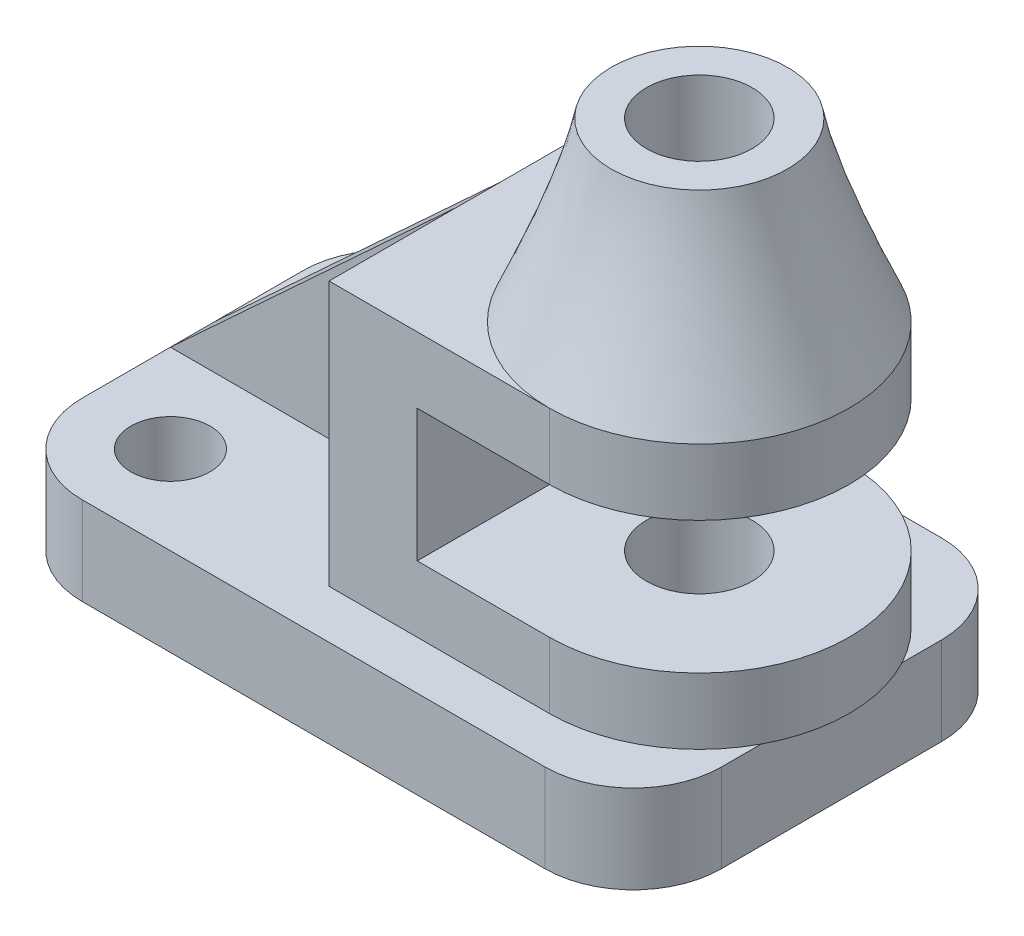
ISO-10303-21;
HEADER;
FILE_DESCRIPTION(('STEP AP214'),'2;1');
FILE_NAME('part.step','',(''),(''),'','','');
FILE_SCHEMA(('AUTOMOTIVE_DESIGN { 1 0 10303 214 1 1 1 1 }'));
ENDSEC;
DATA;
#1=APPLICATION_CONTEXT('core data for automotive mechanical design processes');
#2=APPLICATION_PROTOCOL_DEFINITION('international standard','automotive_design',2000,#1);
#3=PRODUCT_CONTEXT('',#1,'mechanical');
#4=PRODUCT('Part','Part','',(#3));
#5=PRODUCT_RELATED_PRODUCT_CATEGORY('part','',(#4));
#6=PRODUCT_DEFINITION_FORMATION('','',#4);
#7=PRODUCT_DEFINITION_CONTEXT('part definition',#1,'design');
#8=PRODUCT_DEFINITION('design','',#6,#7);
#9=PRODUCT_DEFINITION_SHAPE('','',#8);
#10=(LENGTH_UNIT() NAMED_UNIT(*) SI_UNIT(.MILLI.,.METRE.));
#11=(NAMED_UNIT(*) PLANE_ANGLE_UNIT() SI_UNIT($,.RADIAN.));
#12=(NAMED_UNIT(*) SI_UNIT($,.STERADIAN.) SOLID_ANGLE_UNIT());
#13=UNCERTAINTY_MEASURE_WITH_UNIT(LENGTH_MEASURE(1.E-05),#10,'distance_accuracy_value','');
#14=(GEOMETRIC_REPRESENTATION_CONTEXT(3) GLOBAL_UNCERTAINTY_ASSIGNED_CONTEXT((#13)) GLOBAL_UNIT_ASSIGNED_CONTEXT((#10,
#11,#12)) REPRESENTATION_CONTEXT('',''));
#15=CARTESIAN_POINT('',(0.,0.,0.));
#16=DIRECTION('',(0.,0.,1.));
#17=DIRECTION('',(1.,0.,0.));
#18=AXIS2_PLACEMENT_3D('',#15,#16,#17);
#19=CARTESIAN_POINT('',(52.5,0.,-25.));
#20=DIRECTION('',(0.,-1.,0.));
#21=DIRECTION('',(0.,0.,-1.));
#22=AXIS2_PLACEMENT_3D('',#19,#20,#21);
#23=PLANE('',#22);
#24=CARTESIAN_POINT('',(-52.5,0.,25.));
#25=DIRECTION('',(0.,1.,0.));
#26=DIRECTION('',(0.,0.,1.));
#27=AXIS2_PLACEMENT_3D('',#24,#25,#26);
#28=CIRCLE('',#27,9.);
#29=CARTESIAN_POINT('',(-52.5,0.,34.));
#30=VERTEX_POINT('',#29);
#31=EDGE_CURVE('E382',#30,#30,#28,.T.);
#32=ORIENTED_EDGE('',*,*,#31,.F.);
#33=EDGE_LOOP('',(#32));
#34=FACE_BOUND('',#33,.T.);
#35=DIRECTION('',(1.,0.,0.));
#36=VECTOR('',#35,1.);
#37=CARTESIAN_POINT('',(-72.5,0.,5.00000000000001));
#38=LINE('',#37,#36);
#39=CARTESIAN_POINT('',(-72.5,0.,5.));
#40=VERTEX_POINT('',#39);
#41=CARTESIAN_POINT('',(-7.49999999999999,0.,5.00000000000001));
#42=VERTEX_POINT('',#41);
#43=EDGE_CURVE('E192',#40,#42,#38,.T.);
#44=ORIENTED_EDGE('',*,*,#43,.F.);
#45=DIRECTION('',(0.,0.,1.));
#46=VECTOR('',#45,1.);
#47=CARTESIAN_POINT('',(-72.5,0.,-24.9999999999999));
#48=LINE('',#47,#46);
#49=CARTESIAN_POINT('',(-72.5,0.,24.9999999999999));
#50=VERTEX_POINT('',#49);
#51=EDGE_CURVE('E196',#40,#50,#48,.T.);
#52=ORIENTED_EDGE('',*,*,#51,.T.);
#53=CARTESIAN_POINT('',(-52.5,0.,25.));
#54=DIRECTION('',(0.,1.,0.));
#55=DIRECTION('',(0.,0.,1.));
#56=AXIS2_PLACEMENT_3D('',#53,#54,#55);
#57=CIRCLE('',#56,20.);
#58=CARTESIAN_POINT('',(-52.5,0.,45.));
#59=VERTEX_POINT('',#58);
#60=EDGE_CURVE('E210',#50,#59,#57,.T.);
#61=ORIENTED_EDGE('',*,*,#60,.T.);
#62=DIRECTION('',(1.,0.,0.));
#63=VECTOR('',#62,1.);
#64=CARTESIAN_POINT('',(-52.4999999999999,0.,45.));
#65=LINE('',#64,#63);
#66=CARTESIAN_POINT('',(52.4999999999999,0.,45.));
#67=VERTEX_POINT('',#66);
#68=EDGE_CURVE('E217',#59,#67,#65,.T.);
#69=ORIENTED_EDGE('',*,*,#68,.T.);
#70=CARTESIAN_POINT('',(52.5,0.,25.));
#71=DIRECTION('',(0.,1.,0.));
#72=DIRECTION('',(0.,0.,1.));
#73=AXIS2_PLACEMENT_3D('',#70,#71,#72);
#74=CIRCLE('',#73,20.);
#75=CARTESIAN_POINT('',(72.5,0.,24.9999999999999));
#76=VERTEX_POINT('',#75);
#77=EDGE_CURVE('E220',#67,#76,#74,.T.);
#78=ORIENTED_EDGE('',*,*,#77,.T.);
#79=DIRECTION('',(0.,0.,-1.));
#80=VECTOR('',#79,1.);
#81=CARTESIAN_POINT('',(72.5,0.,-24.9999999999999));
#82=LINE('',#81,#80);
#83=CARTESIAN_POINT('',(72.5,0.,16.));
#84=VERTEX_POINT('',#83);
#85=EDGE_CURVE('E224',#76,#84,#82,.T.);
#86=ORIENTED_EDGE('',*,*,#85,.T.);
#87=CARTESIAN_POINT('',(42.5,0.,0.));
#88=DIRECTION('',(0.,1.,0.));
#89=DIRECTION('',(0.,0.,1.));
#90=AXIS2_PLACEMENT_3D('',#87,#88,#89);
#91=CIRCLE('',#90,34.);
#92=CARTESIAN_POINT('',(42.5,0.,34.));
#93=VERTEX_POINT('',#92);
#94=EDGE_CURVE('E399',#93,#84,#91,.T.);
#95=ORIENTED_EDGE('',*,*,#94,.F.);
#96=DIRECTION('',(1.,0.,0.));
#97=VECTOR('',#96,1.);
#98=CARTESIAN_POINT('',(-7.49999999999998,0.,34.));
#99=LINE('',#98,#97);
#100=CARTESIAN_POINT('',(-7.49999999999998,0.,34.));
#101=VERTEX_POINT('',#100);
#102=EDGE_CURVE('E391',#101,#93,#99,.T.);
#103=ORIENTED_EDGE('',*,*,#102,.F.);
#104=DIRECTION('',(0.,0.,1.));
#105=VECTOR('',#104,1.);
#106=CARTESIAN_POINT('',(-7.49999999999999,0.,-34.));
#107=LINE('',#106,#105);
#108=EDGE_CURVE('E199',#42,#101,#107,.T.);
#109=ORIENTED_EDGE('',*,*,#108,.F.);
#110=EDGE_LOOP('',(#44,#52,#61,#69,#78,#86,#95,#103,#109));
#111=FACE_BOUND('',#110,.T.);
#112=ADVANCED_FACE('F44',(#34,#111),#23,.F.);
#113=CARTESIAN_POINT('',(-52.5,0.,-25.));
#114=DIRECTION('',(0.,1.,0.));
#115=DIRECTION('',(0.,0.,1.));
#116=AXIS2_PLACEMENT_3D('',#113,#114,#115);
#117=CIRCLE('',#116,9.);
#118=CARTESIAN_POINT('',(-52.5,0.,-16.));
#119=VERTEX_POINT('',#118);
#120=EDGE_CURVE('E356',#119,#119,#117,.T.);
#121=ORIENTED_EDGE('',*,*,#120,.F.);
#122=EDGE_LOOP('',(#121));
#123=FACE_BOUND('',#122,.T.);
#124=DIRECTION('',(1.,0.,0.));
#125=VECTOR('',#124,1.);
#126=CARTESIAN_POINT('',(-72.5,0.,-4.99999999999999));
#127=LINE('',#126,#125);
#128=CARTESIAN_POINT('',(-72.5,0.,-4.99999999999999));
#129=VERTEX_POINT('',#128);
#130=CARTESIAN_POINT('',(-7.49999999999999,0.,-5.));
#131=VERTEX_POINT('',#130);
#132=EDGE_CURVE('E200',#129,#131,#127,.T.);
#133=ORIENTED_EDGE('',*,*,#132,.T.);
#134=CARTESIAN_POINT('',(-7.49999999999999,0.,-34.));
#135=VERTEX_POINT('',#134);
#136=EDGE_CURVE('E394',#135,#131,#107,.T.);
#137=ORIENTED_EDGE('',*,*,#136,.F.);
#138=DIRECTION('',(-1.,0.,0.));
#139=VECTOR('',#138,1.);
#140=CARTESIAN_POINT('',(-7.49999999999999,0.,-34.));
#141=LINE('',#140,#139);
#142=CARTESIAN_POINT('',(42.5,0.,-34.));
#143=VERTEX_POINT('',#142);
#144=EDGE_CURVE('E396',#143,#135,#141,.T.);
#145=ORIENTED_EDGE('',*,*,#144,.F.);
#146=CARTESIAN_POINT('',(72.5,0.,-16.0000000000001));
#147=VERTEX_POINT('',#146);
#148=EDGE_CURVE('E232',#147,#143,#91,.T.);
#149=ORIENTED_EDGE('',*,*,#148,.F.);
#150=CARTESIAN_POINT('',(72.5,0.,-24.9999999999999));
#151=VERTEX_POINT('',#150);
#152=EDGE_CURVE('E223',#147,#151,#82,.T.);
#153=ORIENTED_EDGE('',*,*,#152,.T.);
#154=CARTESIAN_POINT('',(52.5,0.,-25.));
#155=DIRECTION('',(0.,1.,0.));
#156=DIRECTION('',(0.,0.,-1.));
#157=AXIS2_PLACEMENT_3D('',#154,#155,#156);
#158=CIRCLE('',#157,20.);
#159=CARTESIAN_POINT('',(52.4999999999999,0.,-45.));
#160=VERTEX_POINT('',#159);
#161=EDGE_CURVE('E348',#151,#160,#158,.T.);
#162=ORIENTED_EDGE('',*,*,#161,.T.);
#163=DIRECTION('',(-1.,0.,0.));
#164=VECTOR('',#163,1.);
#165=CARTESIAN_POINT('',(-52.4999999999999,0.,-45.));
#166=LINE('',#165,#164);
#167=CARTESIAN_POINT('',(-52.4999999999999,0.,-45.));
#168=VERTEX_POINT('',#167);
#169=EDGE_CURVE('E212',#160,#168,#166,.T.);
#170=ORIENTED_EDGE('',*,*,#169,.T.);
#171=CARTESIAN_POINT('',(-52.5,0.,-25.));
#172=DIRECTION('',(0.,1.,0.));
#173=DIRECTION('',(0.,0.,1.));
#174=AXIS2_PLACEMENT_3D('',#171,#172,#173);
#175=CIRCLE('',#174,20.);
#176=CARTESIAN_POINT('',(-72.5,0.,-24.9999999999999));
#177=VERTEX_POINT('',#176);
#178=EDGE_CURVE('E208',#168,#177,#175,.T.);
#179=ORIENTED_EDGE('',*,*,#178,.T.);
#180=EDGE_CURVE('E207',#177,#129,#48,.T.);
#181=ORIENTED_EDGE('',*,*,#180,.T.);
#182=EDGE_LOOP('',(#133,#137,#145,#149,#153,#162,#170,#179,#181));
#183=FACE_BOUND('',#182,.T.);
#184=ADVANCED_FACE('F314',(#123,#183),#23,.F.);
#185=CARTESIAN_POINT('',(-7.49999999999999,60.,-34.));
#186=DIRECTION('',(1.,0.,0.));
#187=DIRECTION('',(0.,0.,-1.));
#188=AXIS2_PLACEMENT_3D('',#185,#186,#187);
#189=PLANE('',#188);
#190=DIRECTION('',(0.,1.,0.));
#191=VECTOR('',#190,1.);
#192=CARTESIAN_POINT('',(-7.49999999999998,60.,5.00000000000001));
#193=LINE('',#192,#191);
#194=CARTESIAN_POINT('',(-7.49999999999999,60.,5.));
#195=VERTEX_POINT('',#194);
#196=EDGE_CURVE('E66',#42,#195,#193,.T.);
#197=ORIENTED_EDGE('',*,*,#196,.F.);
#198=ORIENTED_EDGE('',*,*,#108,.T.);
#199=DIRECTION('',(0.,-1.,0.));
#200=VECTOR('',#199,1.);
#201=CARTESIAN_POINT('',(-7.49999999999998,60.,34.));
#202=LINE('',#201,#200);
#203=CARTESIAN_POINT('',(-7.49999999999998,60.,34.));
#204=VERTEX_POINT('',#203);
#205=EDGE_CURVE('E256',#204,#101,#202,.T.);
#206=ORIENTED_EDGE('',*,*,#205,.F.);
#207=DIRECTION('',(0.,0.,1.));
#208=VECTOR('',#207,1.);
#209=CARTESIAN_POINT('',(-7.49999999999999,60.,-34.));
#210=LINE('',#209,#208);
#211=EDGE_CURVE('E405',#195,#204,#210,.T.);
#212=ORIENTED_EDGE('',*,*,#211,.F.);
#213=EDGE_LOOP('',(#197,#198,#206,#212));
#214=FACE_BOUND('',#213,.T.);
#215=ADVANCED_FACE('F466',(#214),#189,.F.);
#216=DIRECTION('',(0.,-1.,0.));
#217=VECTOR('',#216,1.);
#218=CARTESIAN_POINT('',(-7.49999999999999,60.,-5.));
#219=LINE('',#218,#217);
#220=CARTESIAN_POINT('',(-7.49999999999999,60.,-5.));
#221=VERTEX_POINT('',#220);
#222=EDGE_CURVE('E201',#221,#131,#219,.T.);
#223=ORIENTED_EDGE('',*,*,#222,.F.);
#224=CARTESIAN_POINT('',(-7.49999999999999,60.,-34.));
#225=VERTEX_POINT('',#224);
#226=EDGE_CURVE('E250',#225,#221,#210,.T.);
#227=ORIENTED_EDGE('',*,*,#226,.F.);
#228=DIRECTION('',(0.,-1.,0.));
#229=VECTOR('',#228,1.);
#230=CARTESIAN_POINT('',(-7.49999999999999,60.,-34.));
#231=LINE('',#230,#229);
#232=EDGE_CURVE('E269',#225,#135,#231,.T.);
#233=ORIENTED_EDGE('',*,*,#232,.T.);
#234=ORIENTED_EDGE('',*,*,#136,.T.);
#235=EDGE_LOOP('',(#223,#227,#233,#234));
#236=FACE_BOUND('',#235,.T.);
#237=ADVANCED_FACE('F513',(#236),#189,.F.);
#238=CARTESIAN_POINT('',(42.5,60.,0.));
#239=DIRECTION('',(0.,-1.,0.));
#240=DIRECTION('',(0.,0.,-1.));
#241=AXIS2_PLACEMENT_3D('',#238,#239,#240);
#242=CYLINDRICAL_SURFACE('',#241,34.);
#243=DIRECTION('',(0.,-1.,0.));
#244=VECTOR('',#243,1.);
#245=CARTESIAN_POINT('',(42.5,60.,-34.));
#246=LINE('',#245,#244);
#247=CARTESIAN_POINT('',(42.5,15.,-34.));
#248=VERTEX_POINT('',#247);
#249=EDGE_CURVE('E266',#248,#143,#246,.T.);
#250=ORIENTED_EDGE('',*,*,#249,.F.);
#251=CARTESIAN_POINT('',(42.5,15.,0.));
#252=DIRECTION('',(0.,-1.,0.));
#253=DIRECTION('',(0.,0.,-1.));
#254=AXIS2_PLACEMENT_3D('',#251,#252,#253);
#255=CIRCLE('',#254,34.);
#256=CARTESIAN_POINT('',(42.5,15.,34.));
#257=VERTEX_POINT('',#256);
#258=EDGE_CURVE('E537',#248,#257,#255,.T.);
#259=ORIENTED_EDGE('',*,*,#258,.T.);
#260=DIRECTION('',(0.,-1.,0.));
#261=VECTOR('',#260,1.);
#262=CARTESIAN_POINT('',(42.5,60.,34.));
#263=LINE('',#262,#261);
#264=EDGE_CURVE('E249',#257,#93,#263,.T.);
#265=ORIENTED_EDGE('',*,*,#264,.T.);
#266=ORIENTED_EDGE('',*,*,#94,.T.);
#267=EDGE_CURVE('E402',#84,#147,#91,.T.);
#268=ORIENTED_EDGE('',*,*,#267,.T.);
#269=ORIENTED_EDGE('',*,*,#148,.T.);
#270=EDGE_LOOP('',(#250,#259,#265,#266,#268,#269));
#271=FACE_BOUND('',#270,.T.);
#272=ADVANCED_FACE('F297',(#271),#242,.T.);
#273=CARTESIAN_POINT('',(42.5,-20.,0.));
#274=DIRECTION('',(0.,1.,0.));
#275=DIRECTION('',(0.,0.,1.));
#276=AXIS2_PLACEMENT_3D('',#273,#274,#275);
#277=CYLINDRICAL_SURFACE('',#276,12.);
#278=CARTESIAN_POINT('',(42.5,15.,0.));
#279=DIRECTION('',(0.,-1.,0.));
#280=DIRECTION('',(0.,0.,-1.));
#281=AXIS2_PLACEMENT_3D('',#278,#279,#280);
#282=CIRCLE('',#281,12.);
#283=CARTESIAN_POINT('',(42.5,15.,12.));
#284=VERTEX_POINT('',#283);
#285=EDGE_CURVE('E264',#284,#284,#282,.F.);
#286=CARTESIAN_POINT('',(42.5,-20.,0.));
#287=DIRECTION('',(0.,1.,0.));
#288=DIRECTION('',(0.,0.,1.));
#289=AXIS2_PLACEMENT_3D('',#286,#287,#288);
#290=CIRCLE('',#289,12.);
#291=CARTESIAN_POINT('',(42.5,-20.,12.));
#292=VERTEX_POINT('',#291);
#293=EDGE_CURVE('E411',#292,#292,#290,.T.);
#294=CARTESIAN_POINT('',(42.5,15.,12.));
#295=CARTESIAN_POINT('',(42.5,14.6354166666667,12.));
#296=CARTESIAN_POINT('',(42.5,14.2708333333333,12.));
#297=CARTESIAN_POINT('',(42.5,13.5416666666667,12.));
#298=CARTESIAN_POINT('',(42.5,13.1770833333333,12.));
#299=CARTESIAN_POINT('',(42.5,12.4479166666667,12.));
#300=CARTESIAN_POINT('',(42.5,12.0833333333333,12.));
#301=CARTESIAN_POINT('',(42.5,11.3541666666667,12.));
#302=CARTESIAN_POINT('',(42.5,10.9895833333333,12.));
#303=CARTESIAN_POINT('',(42.5,10.2604166666667,12.));
#304=CARTESIAN_POINT('',(42.5,9.89583333333334,12.));
#305=CARTESIAN_POINT('',(42.5,9.16666666666667,12.));
#306=CARTESIAN_POINT('',(42.5,8.80208333333334,12.));
#307=CARTESIAN_POINT('',(42.5,8.07291666666667,12.));
#308=CARTESIAN_POINT('',(42.5,7.70833333333334,12.));
#309=CARTESIAN_POINT('',(42.5,6.97916666666667,12.));
#310=CARTESIAN_POINT('',(42.5,6.61458333333334,12.));
#311=CARTESIAN_POINT('',(42.5,5.88541666666667,12.));
#312=CARTESIAN_POINT('',(42.5,5.52083333333334,12.));
#313=CARTESIAN_POINT('',(42.5,4.79166666666667,12.));
#314=CARTESIAN_POINT('',(42.5,4.42708333333334,12.));
#315=CARTESIAN_POINT('',(42.5,3.69791666666667,12.));
#316=CARTESIAN_POINT('',(42.5,3.33333333333334,12.));
#317=CARTESIAN_POINT('',(42.5,2.60416666666667,12.));
#318=CARTESIAN_POINT('',(42.5,2.23958333333334,12.));
#319=CARTESIAN_POINT('',(42.5,1.51041666666667,12.));
#320=CARTESIAN_POINT('',(42.5,1.14583333333334,12.));
#321=CARTESIAN_POINT('',(42.5,0.416666666666668,12.));
#322=CARTESIAN_POINT('',(42.5,0.0520833333333356,12.));
#323=CARTESIAN_POINT('',(42.5,-0.67708333333333,12.));
#324=CARTESIAN_POINT('',(42.5,-1.04166666666666,12.));
#325=CARTESIAN_POINT('',(42.5,-1.77083333333333,12.));
#326=CARTESIAN_POINT('',(42.5,-2.13541666666667,12.));
#327=CARTESIAN_POINT('',(42.5,-2.86458333333333,12.));
#328=CARTESIAN_POINT('',(42.5,-3.22916666666667,12.));
#329=CARTESIAN_POINT('',(42.5,-3.95833333333333,12.));
#330=CARTESIAN_POINT('',(42.5,-4.32291666666667,12.));
#331=CARTESIAN_POINT('',(42.5,-5.05208333333333,12.));
#332=CARTESIAN_POINT('',(42.5,-5.41666666666667,12.));
#333=CARTESIAN_POINT('',(42.5,-6.14583333333333,12.));
#334=CARTESIAN_POINT('',(42.5,-6.51041666666667,12.));
#335=CARTESIAN_POINT('',(42.5,-7.23958333333333,12.));
#336=CARTESIAN_POINT('',(42.5,-7.60416666666667,12.));
#337=CARTESIAN_POINT('',(42.5,-8.33333333333333,12.));
#338=CARTESIAN_POINT('',(42.5,-8.69791666666667,12.));
#339=CARTESIAN_POINT('',(42.5,-9.42708333333333,12.));
#340=CARTESIAN_POINT('',(42.5,-9.79166666666667,12.));
#341=CARTESIAN_POINT('',(42.5,-10.5208333333333,12.));
#342=CARTESIAN_POINT('',(42.5,-10.8854166666667,12.));
#343=CARTESIAN_POINT('',(42.5,-11.6145833333333,12.));
#344=CARTESIAN_POINT('',(42.5,-11.9791666666667,12.));
#345=CARTESIAN_POINT('',(42.5,-12.7083333333333,12.));
#346=CARTESIAN_POINT('',(42.5,-13.0729166666667,12.));
#347=CARTESIAN_POINT('',(42.5,-13.8020833333333,12.));
#348=CARTESIAN_POINT('',(42.5,-14.1666666666667,12.));
#349=CARTESIAN_POINT('',(42.5,-14.8958333333333,12.));
#350=CARTESIAN_POINT('',(42.5,-15.2604166666667,12.));
#351=CARTESIAN_POINT('',(42.5,-15.9895833333333,12.));
#352=CARTESIAN_POINT('',(42.5,-16.3541666666667,12.));
#353=CARTESIAN_POINT('',(42.5,-17.0833333333333,12.));
#354=CARTESIAN_POINT('',(42.5,-17.4479166666667,12.));
#355=CARTESIAN_POINT('',(42.5,-18.1770833333333,12.));
#356=CARTESIAN_POINT('',(42.5,-18.5416666666667,12.));
#357=CARTESIAN_POINT('',(42.5,-19.2708333333333,12.));
#358=CARTESIAN_POINT('',(42.5,-19.6354166666667,12.));
#359=CARTESIAN_POINT('',(42.5,-20.,12.));
#360=B_SPLINE_CURVE_WITH_KNOTS('',3,(#294,#295,#296,#297,#298,#299,#300,#301,#302,#303,#304,
#305,#306,#307,#308,#309,#310,#311,#312,#313,#314,#315,#316,#317,#318,#319,#320,#321,#322,#323,
#324,#325,#326,#327,#328,#329,#330,#331,#332,#333,#334,#335,#336,#337,#338,#339,#340,#341,#342,
#343,#344,#345,#346,#347,#348,#349,#350,#351,#352,#353,#354,#355,#356,#357,#358,#359),
.UNSPECIFIED.,.F.,.F.,(4,2,2,2,2,2,2,2,2,2,2,2,2,2,2,2,2,2,2,2,2,2,2,2,2,2,2,2,2,2,2,2,4),(0.,
1.09375,2.1875,3.28125,4.375,5.46875,6.5625,7.65625,8.75,9.84375,10.9375,12.03125,13.125,
14.21875,15.3125,16.40625,17.5,18.59375,19.6875,20.78125,21.875,22.96875,24.0625,25.15625,26.25,
27.34375,28.4375,29.53125,30.625,31.71875,32.8125,33.90625,35.),.UNSPECIFIED.);
#361=EDGE_CURVE('BSEAM504',#284,#292,#360,.T.);
#362=ORIENTED_EDGE('',*,*,#285,.T.);
#363=ORIENTED_EDGE('',*,*,#293,.F.);
#364=ORIENTED_EDGE('',*,*,#361,.T.);
#365=ORIENTED_EDGE('',*,*,#361,.F.);
#366=EDGE_LOOP('',(#362,#364,#363,#365));
#367=FACE_BOUND('',#366,.T.);
#368=ADVANCED_FACE('F504',(#367),#277,.F.);
#369=CARTESIAN_POINT('',(42.5,60.,0.));
#370=DIRECTION('',(0.,1.,0.));
#371=DIRECTION('',(0.,0.,1.));
#372=AXIS2_PLACEMENT_3D('',#369,#370,#371);
#373=PLANE('',#372);
#374=DIRECTION('',(0.,0.,1.));
#375=VECTOR('',#374,1.);
#376=CARTESIAN_POINT('',(-7.49999999999999,60.,-45.));
#377=LINE('',#376,#375);
#378=EDGE_CURVE('E59',#221,#195,#377,.T.);
#379=ORIENTED_EDGE('',*,*,#378,.T.);
#380=ORIENTED_EDGE('',*,*,#211,.T.);
#381=DIRECTION('',(1.,0.,0.));
#382=VECTOR('',#381,1.);
#383=CARTESIAN_POINT('',(-7.49999999999998,60.,34.));
#384=LINE('',#383,#382);
#385=CARTESIAN_POINT('',(42.5,60.,34.));
#386=VERTEX_POINT('',#385);
#387=EDGE_CURVE('E247',#204,#386,#384,.T.);
#388=ORIENTED_EDGE('',*,*,#387,.T.);
#389=CARTESIAN_POINT('',(42.5,60.,0.));
#390=DIRECTION('',(0.,-1.,0.));
#391=DIRECTION('',(0.,0.,-1.));
#392=AXIS2_PLACEMENT_3D('',#389,#390,#391);
#393=CIRCLE('',#392,34.);
#394=CARTESIAN_POINT('',(42.5,60.,-34.));
#395=VERTEX_POINT('',#394);
#396=EDGE_CURVE('E52',#386,#395,#393,.T.);
#397=ORIENTED_EDGE('',*,*,#396,.T.);
#398=DIRECTION('',(-1.,0.,0.));
#399=VECTOR('',#398,1.);
#400=CARTESIAN_POINT('',(-7.49999999999999,60.,-34.));
#401=LINE('',#400,#399);
#402=EDGE_CURVE('E259',#395,#225,#401,.T.);
#403=ORIENTED_EDGE('',*,*,#402,.T.);
#404=ORIENTED_EDGE('',*,*,#226,.T.);
#405=EDGE_LOOP('',(#379,#380,#388,#397,#403,#404));
#406=FACE_BOUND('',#405,.T.);
#407=ADVANCED_FACE('F438',(#406),#373,.T.);
#408=CARTESIAN_POINT('',(52.5,-20.,-25.));
#409=DIRECTION('',(0.,1.,0.));
#410=DIRECTION('',(0.,0.,1.));
#411=AXIS2_PLACEMENT_3D('',#408,#409,#410);
#412=CYLINDRICAL_SURFACE('',#411,20.);
#413=ORIENTED_EDGE('',*,*,#161,.F.);
#414=DIRECTION('',(0.,1.,0.));
#415=VECTOR('',#414,1.);
#416=CARTESIAN_POINT('',(72.5,-20.,-24.9999999999999));
#417=LINE('',#416,#415);
#418=CARTESIAN_POINT('',(72.5,-20.,-24.9999999999999));
#419=VERTEX_POINT('',#418);
#420=EDGE_CURVE('E229',#419,#151,#417,.T.);
#421=ORIENTED_EDGE('',*,*,#420,.F.);
#422=CARTESIAN_POINT('',(52.5,-20.,-25.));
#423=DIRECTION('',(0.,1.,0.));
#424=DIRECTION('',(0.,0.,-1.));
#425=AXIS2_PLACEMENT_3D('',#422,#423,#424);
#426=CIRCLE('',#425,20.);
#427=CARTESIAN_POINT('',(52.4999999999999,-20.,-45.));
#428=VERTEX_POINT('',#427);
#429=EDGE_CURVE('E227',#419,#428,#426,.T.);
#430=ORIENTED_EDGE('',*,*,#429,.T.);
#431=DIRECTION('',(0.,1.,0.));
#432=VECTOR('',#431,1.);
#433=CARTESIAN_POINT('',(52.4999999999999,-20.,-45.));
#434=LINE('',#433,#432);
#435=EDGE_CURVE('E244',#428,#160,#434,.T.);
#436=ORIENTED_EDGE('',*,*,#435,.T.);
#437=EDGE_LOOP('',(#413,#421,#430,#436));
#438=FACE_BOUND('',#437,.T.);
#439=ADVANCED_FACE('F46',(#438),#412,.T.);
#440=CARTESIAN_POINT('',(72.5,-20.,-24.9999999999999));
#441=DIRECTION('',(1.,0.,0.));
#442=DIRECTION('',(0.,0.,-1.));
#443=AXIS2_PLACEMENT_3D('',#440,#441,#442);
#444=PLANE('',#443);
#445=ORIENTED_EDGE('',*,*,#85,.F.);
#446=DIRECTION('',(0.,1.,0.));
#447=VECTOR('',#446,1.);
#448=CARTESIAN_POINT('',(72.5,-20.,24.9999999999999));
#449=LINE('',#448,#447);
#450=CARTESIAN_POINT('',(72.5,-20.,24.9999999999999));
#451=VERTEX_POINT('',#450);
#452=EDGE_CURVE('E233',#451,#76,#449,.T.);
#453=ORIENTED_EDGE('',*,*,#452,.F.);
#454=DIRECTION('',(0.,0.,-1.));
#455=VECTOR('',#454,1.);
#456=CARTESIAN_POINT('',(72.5,-20.,-24.9999999999999));
#457=LINE('',#456,#455);
#458=EDGE_CURVE('E246',#451,#419,#457,.T.);
#459=ORIENTED_EDGE('',*,*,#458,.T.);
#460=ORIENTED_EDGE('',*,*,#420,.T.);
#461=ORIENTED_EDGE('',*,*,#152,.F.);
#462=EDGE_CURVE('E228',#84,#147,#82,.T.);
#463=ORIENTED_EDGE('',*,*,#462,.F.);
#464=EDGE_LOOP('',(#445,#453,#459,#460,#461,#463));
#465=FACE_BOUND('',#464,.T.);
#466=ADVANCED_FACE('F316',(#465),#444,.T.);
#467=CARTESIAN_POINT('',(52.5,-20.,25.));
#468=DIRECTION('',(0.,1.,0.));
#469=DIRECTION('',(0.,0.,1.));
#470=AXIS2_PLACEMENT_3D('',#467,#468,#469);
#471=CYLINDRICAL_SURFACE('',#470,20.);
#472=ORIENTED_EDGE('',*,*,#77,.F.);
#473=DIRECTION('',(0.,1.,0.));
#474=VECTOR('',#473,1.);
#475=CARTESIAN_POINT('',(52.4999999999999,-20.,45.));
#476=LINE('',#475,#474);
#477=CARTESIAN_POINT('',(52.4999999999999,-20.,45.));
#478=VERTEX_POINT('',#477);
#479=EDGE_CURVE('E235',#478,#67,#476,.T.);
#480=ORIENTED_EDGE('',*,*,#479,.F.);
#481=CARTESIAN_POINT('',(52.5,-20.,25.));
#482=DIRECTION('',(0.,1.,0.));
#483=DIRECTION('',(0.,0.,1.));
#484=AXIS2_PLACEMENT_3D('',#481,#482,#483);
#485=CIRCLE('',#484,20.);
#486=EDGE_CURVE('E361',#478,#451,#485,.T.);
#487=ORIENTED_EDGE('',*,*,#486,.T.);
#488=ORIENTED_EDGE('',*,*,#452,.T.);
#489=EDGE_LOOP('',(#472,#480,#487,#488));
#490=FACE_BOUND('',#489,.T.);
#491=ADVANCED_FACE('F319',(#490),#471,.T.);
#492=CARTESIAN_POINT('',(-52.4999999999999,-20.,45.));
#493=DIRECTION('',(0.,0.,1.));
#494=DIRECTION('',(1.,0.,0.));
#495=AXIS2_PLACEMENT_3D('',#492,#493,#494);
#496=PLANE('',#495);
#497=ORIENTED_EDGE('',*,*,#68,.F.);
#498=DIRECTION('',(0.,1.,0.));
#499=VECTOR('',#498,1.);
#500=CARTESIAN_POINT('',(-52.5,-20.,45.));
#501=LINE('',#500,#499);
#502=CARTESIAN_POINT('',(-52.5,-20.,45.));
#503=VERTEX_POINT('',#502);
#504=EDGE_CURVE('E237',#503,#59,#501,.T.);
#505=ORIENTED_EDGE('',*,*,#504,.F.);
#506=DIRECTION('',(1.,0.,0.));
#507=VECTOR('',#506,1.);
#508=CARTESIAN_POINT('',(-52.4999999999999,-20.,45.));
#509=LINE('',#508,#507);
#510=EDGE_CURVE('E364',#503,#478,#509,.T.);
#511=ORIENTED_EDGE('',*,*,#510,.T.);
#512=ORIENTED_EDGE('',*,*,#479,.T.);
#513=EDGE_LOOP('',(#497,#505,#511,#512));
#514=FACE_BOUND('',#513,.T.);
#515=ADVANCED_FACE('F323',(#514),#496,.T.);
#516=CARTESIAN_POINT('',(-52.5,-20.,25.));
#517=DIRECTION('',(0.,1.,0.));
#518=DIRECTION('',(0.,0.,1.));
#519=AXIS2_PLACEMENT_3D('',#516,#517,#518);
#520=CYLINDRICAL_SURFACE('',#519,20.);
#521=ORIENTED_EDGE('',*,*,#60,.F.);
#522=DIRECTION('',(0.,1.,0.));
#523=VECTOR('',#522,1.);
#524=CARTESIAN_POINT('',(-72.5,-20.,24.9999999999999));
#525=LINE('',#524,#523);
#526=CARTESIAN_POINT('',(-72.5,-20.,24.9999999999999));
#527=VERTEX_POINT('',#526);
#528=EDGE_CURVE('E205',#527,#50,#525,.T.);
#529=ORIENTED_EDGE('',*,*,#528,.F.);
#530=CARTESIAN_POINT('',(-52.5,-20.,25.));
#531=DIRECTION('',(0.,1.,0.));
#532=DIRECTION('',(0.,0.,1.));
#533=AXIS2_PLACEMENT_3D('',#530,#531,#532);
#534=CIRCLE('',#533,20.);
#535=EDGE_CURVE('E367',#527,#503,#534,.T.);
#536=ORIENTED_EDGE('',*,*,#535,.T.);
#537=ORIENTED_EDGE('',*,*,#504,.T.);
#538=EDGE_LOOP('',(#521,#529,#536,#537));
#539=FACE_BOUND('',#538,.T.);
#540=ADVANCED_FACE('F327',(#539),#520,.T.);
#541=CARTESIAN_POINT('',(-72.5,-20.,-24.9999999999999));
#542=DIRECTION('',(-1.,0.,0.));
#543=DIRECTION('',(0.,0.,1.));
#544=AXIS2_PLACEMENT_3D('',#541,#542,#543);
#545=PLANE('',#544);
#546=DIRECTION('',(0.,0.,1.));
#547=VECTOR('',#546,1.);
#548=CARTESIAN_POINT('',(-72.5,0.,-45.));
#549=LINE('',#548,#547);
#550=EDGE_CURVE('E179',#129,#40,#549,.T.);
#551=ORIENTED_EDGE('',*,*,#550,.F.);
#552=ORIENTED_EDGE('',*,*,#180,.F.);
#553=DIRECTION('',(0.,1.,0.));
#554=VECTOR('',#553,1.);
#555=CARTESIAN_POINT('',(-72.5,-20.,-24.9999999999999));
#556=LINE('',#555,#554);
#557=CARTESIAN_POINT('',(-72.5,-20.,-24.9999999999999));
#558=VERTEX_POINT('',#557);
#559=EDGE_CURVE('E240',#558,#177,#556,.T.);
#560=ORIENTED_EDGE('',*,*,#559,.F.);
#561=DIRECTION('',(0.,0.,1.));
#562=VECTOR('',#561,1.);
#563=CARTESIAN_POINT('',(-72.5,-20.,-24.9999999999999));
#564=LINE('',#563,#562);
#565=EDGE_CURVE('E370',#558,#527,#564,.T.);
#566=ORIENTED_EDGE('',*,*,#565,.T.);
#567=ORIENTED_EDGE('',*,*,#528,.T.);
#568=ORIENTED_EDGE('',*,*,#51,.F.);
#569=EDGE_LOOP('',(#551,#552,#560,#566,#567,#568));
#570=FACE_BOUND('',#569,.T.);
#571=ADVANCED_FACE('F203',(#570),#545,.T.);
#572=CARTESIAN_POINT('',(-52.5,-20.,-25.));
#573=DIRECTION('',(0.,1.,0.));
#574=DIRECTION('',(0.,0.,1.));
#575=AXIS2_PLACEMENT_3D('',#572,#573,#574);
#576=CYLINDRICAL_SURFACE('',#575,20.);
#577=ORIENTED_EDGE('',*,*,#178,.F.);
#578=DIRECTION('',(0.,1.,0.));
#579=VECTOR('',#578,1.);
#580=CARTESIAN_POINT('',(-52.4999999999999,-20.,-45.));
#581=LINE('',#580,#579);
#582=CARTESIAN_POINT('',(-52.4999999999999,-20.,-45.));
#583=VERTEX_POINT('',#582);
#584=EDGE_CURVE('E242',#583,#168,#581,.T.);
#585=ORIENTED_EDGE('',*,*,#584,.F.);
#586=CARTESIAN_POINT('',(-52.5,-20.,-25.));
#587=DIRECTION('',(0.,1.,0.));
#588=DIRECTION('',(0.,0.,1.));
#589=AXIS2_PLACEMENT_3D('',#586,#587,#588);
#590=CIRCLE('',#589,20.);
#591=EDGE_CURVE('E372',#583,#558,#590,.T.);
#592=ORIENTED_EDGE('',*,*,#591,.T.);
#593=ORIENTED_EDGE('',*,*,#559,.T.);
#594=EDGE_LOOP('',(#577,#585,#592,#593));
#595=FACE_BOUND('',#594,.T.);
#596=ADVANCED_FACE('F334',(#595),#576,.T.);
#597=CARTESIAN_POINT('',(-52.4999999999999,-20.,-45.));
#598=DIRECTION('',(0.,0.,-1.));
#599=DIRECTION('',(-1.,0.,0.));
#600=AXIS2_PLACEMENT_3D('',#597,#598,#599);
#601=PLANE('',#600);
#602=ORIENTED_EDGE('',*,*,#169,.F.);
#603=ORIENTED_EDGE('',*,*,#435,.F.);
#604=DIRECTION('',(-1.,0.,0.));
#605=VECTOR('',#604,1.);
#606=CARTESIAN_POINT('',(-52.4999999999999,-20.,-45.));
#607=LINE('',#606,#605);
#608=EDGE_CURVE('E375',#428,#583,#607,.T.);
#609=ORIENTED_EDGE('',*,*,#608,.T.);
#610=ORIENTED_EDGE('',*,*,#584,.T.);
#611=EDGE_LOOP('',(#602,#603,#609,#610));
#612=FACE_BOUND('',#611,.T.);
#613=ADVANCED_FACE('F310',(#612),#601,.T.);
#614=CARTESIAN_POINT('',(52.5,-20.,-25.));
#615=DIRECTION('',(0.,-1.,0.));
#616=DIRECTION('',(0.,0.,-1.));
#617=AXIS2_PLACEMENT_3D('',#614,#615,#616);
#618=PLANE('',#617);
#619=ORIENTED_EDGE('',*,*,#293,.T.);
#620=EDGE_LOOP('',(#619));
#621=FACE_BOUND('',#620,.T.);
#622=CARTESIAN_POINT('',(-52.5,-20.,25.));
#623=DIRECTION('',(0.,1.,0.));
#624=DIRECTION('',(0.,0.,1.));
#625=AXIS2_PLACEMENT_3D('',#622,#623,#624);
#626=CIRCLE('',#625,9.);
#627=CARTESIAN_POINT('',(-52.5,-20.,34.));
#628=VERTEX_POINT('',#627);
#629=EDGE_CURVE('E380',#628,#628,#626,.T.);
#630=ORIENTED_EDGE('',*,*,#629,.T.);
#631=EDGE_LOOP('',(#630));
#632=FACE_BOUND('',#631,.T.);
#633=CARTESIAN_POINT('',(-52.5,-20.,-25.));
#634=DIRECTION('',(0.,1.,0.));
#635=DIRECTION('',(0.,0.,1.));
#636=AXIS2_PLACEMENT_3D('',#633,#634,#635);
#637=CIRCLE('',#636,9.);
#638=CARTESIAN_POINT('',(-52.5,-20.,-16.));
#639=VERTEX_POINT('',#638);
#640=EDGE_CURVE('E353',#639,#639,#637,.T.);
#641=ORIENTED_EDGE('',*,*,#640,.T.);
#642=EDGE_LOOP('',(#641));
#643=FACE_BOUND('',#642,.T.);
#644=ORIENTED_EDGE('',*,*,#429,.F.);
#645=ORIENTED_EDGE('',*,*,#458,.F.);
#646=ORIENTED_EDGE('',*,*,#486,.F.);
#647=ORIENTED_EDGE('',*,*,#510,.F.);
#648=ORIENTED_EDGE('',*,*,#535,.F.);
#649=ORIENTED_EDGE('',*,*,#565,.F.);
#650=ORIENTED_EDGE('',*,*,#591,.F.);
#651=ORIENTED_EDGE('',*,*,#608,.F.);
#652=EDGE_LOOP('',(#644,#645,#646,#647,#648,#649,#650,#651));
#653=FACE_BOUND('',#652,.T.);
#654=ADVANCED_FACE('F306',(#621,#632,#643,#653),#618,.T.);
#655=CARTESIAN_POINT('',(-52.5,-20.,-25.));
#656=DIRECTION('',(0.,1.,0.));
#657=DIRECTION('',(0.,0.,1.));
#658=AXIS2_PLACEMENT_3D('',#655,#656,#657);
#659=CYLINDRICAL_SURFACE('',#658,9.);
#660=ORIENTED_EDGE('',*,*,#640,.F.);
#661=EDGE_LOOP('',(#660));
#662=FACE_BOUND('',#661,.T.);
#663=ORIENTED_EDGE('',*,*,#120,.T.);
#664=EDGE_LOOP('',(#663));
#665=FACE_BOUND('',#664,.T.);
#666=ADVANCED_FACE('F302',(#662,#665),#659,.F.);
#667=CARTESIAN_POINT('',(-52.5,-20.,25.));
#668=DIRECTION('',(0.,1.,0.));
#669=DIRECTION('',(0.,0.,1.));
#670=AXIS2_PLACEMENT_3D('',#667,#668,#669);
#671=CYLINDRICAL_SURFACE('',#670,9.);
#672=ORIENTED_EDGE('',*,*,#629,.F.);
#673=EDGE_LOOP('',(#672));
#674=FACE_BOUND('',#673,.T.);
#675=ORIENTED_EDGE('',*,*,#31,.T.);
#676=EDGE_LOOP('',(#675));
#677=FACE_BOUND('',#676,.T.);
#678=ADVANCED_FACE('F299',(#674,#677),#671,.F.);
#679=CARTESIAN_POINT('',(42.5,0.,0.));
#680=DIRECTION('',(0.,1.,0.));
#681=DIRECTION('',(0.,0.,1.));
#682=AXIS2_PLACEMENT_3D('',#679,#680,#681);
#683=PLANE('',#682);
#684=ORIENTED_EDGE('',*,*,#267,.F.);
#685=ORIENTED_EDGE('',*,*,#462,.T.);
#686=EDGE_LOOP('',(#684,#685));
#687=FACE_BOUND('',#686,.T.);
#688=ADVANCED_FACE('F296',(#687),#683,.F.);
#689=CARTESIAN_POINT('',(42.5,45.,34.));
#690=VERTEX_POINT('',#689);
#691=EDGE_CURVE('E253',#386,#690,#263,.T.);
#692=ORIENTED_EDGE('',*,*,#691,.T.);
#693=CARTESIAN_POINT('',(42.5,45.,0.));
#694=DIRECTION('',(0.,1.,0.));
#695=DIRECTION('',(0.,0.,1.));
#696=AXIS2_PLACEMENT_3D('',#693,#694,#695);
#697=CIRCLE('',#696,34.);
#698=CARTESIAN_POINT('',(42.5,45.,-34.));
#699=VERTEX_POINT('',#698);
#700=EDGE_CURVE('E474',#690,#699,#697,.T.);
#701=ORIENTED_EDGE('',*,*,#700,.T.);
#702=EDGE_CURVE('E268',#395,#699,#246,.T.);
#703=ORIENTED_EDGE('',*,*,#702,.F.);
#704=CARTESIAN_POINT('',(10.620019023894,60.,11.8180714570152));
#705=CARTESIAN_POINT('',(34.2561619379245,60.,75.5780334092272));
#706=CARTESIAN_POINT('',(98.0161238901365,60.,51.9418904951968));
#707=CARTESIAN_POINT('',(74.379980976106,60.,-11.8180714570152));
#708=CARTESIAN_POINT('',(50.7438380620756,60.,-75.5780334092273));
#709=CARTESIAN_POINT('',(-13.0161238901365,60.,-51.9418904951968));
#710=CARTESIAN_POINT('',(10.620019023894,60.,11.8180714570152));
#711=(BOUNDED_CURVE() B_SPLINE_CURVE(3,(#704,#705,#706,#707,#708,#709,#710),.UNSPECIFIED.,.T.,
.F.) B_SPLINE_CURVE_WITH_KNOTS((4,3,4),(0.,0.5,1.),
.UNSPECIFIED.) CURVE() GEOMETRIC_REPRESENTATION_ITEM() RATIONAL_B_SPLINE_CURVE((1.,
0.333333333333334,0.333333333333334,1.,0.333333333333333,0.333333333333333,1.)) REPRESENTATION_ITEM(''));
#712=EDGE_CURVE('E278',#386,#395,#711,.T.);
#713=ORIENTED_EDGE('',*,*,#712,.F.);
#714=EDGE_LOOP('',(#692,#701,#703,#713));
#715=FACE_BOUND('',#714,.T.);
#716=ADVANCED_FACE('F285',(#715),#242,.T.);
#717=CARTESIAN_POINT('',(-7.49999999999999,60.,-34.));
#718=DIRECTION('',(0.,0.,1.));
#719=DIRECTION('',(1.,0.,0.));
#720=AXIS2_PLACEMENT_3D('',#717,#718,#719);
#721=PLANE('',#720);
#722=DIRECTION('',(0.,-1.,0.));
#723=VECTOR('',#722,1.);
#724=CARTESIAN_POINT('',(12.5,60.,-34.));
#725=LINE('',#724,#723);
#726=CARTESIAN_POINT('',(12.5,45.,-34.));
#727=VERTEX_POINT('',#726);
#728=CARTESIAN_POINT('',(12.5,15.,-34.));
#729=VERTEX_POINT('',#728);
#730=EDGE_CURVE('E533',#727,#729,#725,.T.);
#731=ORIENTED_EDGE('',*,*,#730,.T.);
#732=DIRECTION('',(1.,0.,0.));
#733=VECTOR('',#732,1.);
#734=CARTESIAN_POINT('',(-7.49999999999999,15.,-34.));
#735=LINE('',#734,#733);
#736=EDGE_CURVE('E544',#729,#248,#735,.T.);
#737=ORIENTED_EDGE('',*,*,#736,.T.);
#738=ORIENTED_EDGE('',*,*,#249,.T.);
#739=ORIENTED_EDGE('',*,*,#144,.T.);
#740=ORIENTED_EDGE('',*,*,#232,.F.);
#741=ORIENTED_EDGE('',*,*,#402,.F.);
#742=ORIENTED_EDGE('',*,*,#702,.T.);
#743=DIRECTION('',(-1.,0.,0.));
#744=VECTOR('',#743,1.);
#745=CARTESIAN_POINT('',(-7.49999999999999,45.,-34.));
#746=LINE('',#745,#744);
#747=EDGE_CURVE('E477',#699,#727,#746,.T.);
#748=ORIENTED_EDGE('',*,*,#747,.T.);
#749=EDGE_LOOP('',(#731,#737,#738,#739,#740,#741,#742,#748));
#750=FACE_BOUND('',#749,.T.);
#751=ADVANCED_FACE('F295',(#750),#721,.F.);
#752=CARTESIAN_POINT('',(-7.49999999999998,60.,34.));
#753=DIRECTION('',(0.,0.,-1.));
#754=DIRECTION('',(-1.,0.,0.));
#755=AXIS2_PLACEMENT_3D('',#752,#753,#754);
#756=PLANE('',#755);
#757=ORIENTED_EDGE('',*,*,#264,.F.);
#758=DIRECTION('',(1.,0.,0.));
#759=VECTOR('',#758,1.);
#760=CARTESIAN_POINT('',(12.5,15.,34.));
#761=LINE('',#760,#759);
#762=CARTESIAN_POINT('',(12.5,15.,34.));
#763=VERTEX_POINT('',#762);
#764=EDGE_CURVE('E551',#763,#257,#761,.T.);
#765=ORIENTED_EDGE('',*,*,#764,.F.);
#766=DIRECTION('',(0.,-1.,0.));
#767=VECTOR('',#766,1.);
#768=CARTESIAN_POINT('',(12.5,45.,34.));
#769=LINE('',#768,#767);
#770=CARTESIAN_POINT('',(12.5,45.,34.));
#771=VERTEX_POINT('',#770);
#772=EDGE_CURVE('E554',#771,#763,#769,.T.);
#773=ORIENTED_EDGE('',*,*,#772,.F.);
#774=DIRECTION('',(-1.,0.,0.));
#775=VECTOR('',#774,1.);
#776=CARTESIAN_POINT('',(12.5,45.,34.));
#777=LINE('',#776,#775);
#778=EDGE_CURVE('E472',#690,#771,#777,.T.);
#779=ORIENTED_EDGE('',*,*,#778,.F.);
#780=ORIENTED_EDGE('',*,*,#691,.F.);
#781=ORIENTED_EDGE('',*,*,#387,.F.);
#782=ORIENTED_EDGE('',*,*,#205,.T.);
#783=ORIENTED_EDGE('',*,*,#102,.T.);
#784=EDGE_LOOP('',(#757,#765,#773,#779,#780,#781,#782,#783));
#785=FACE_BOUND('',#784,.T.);
#786=ADVANCED_FACE('F428',(#785),#756,.F.);
#787=CARTESIAN_POINT('',(42.5,100.,0.));
#788=DIRECTION('',(0.,1.,0.));
#789=DIRECTION('',(0.,0.,1.));
#790=AXIS2_PLACEMENT_3D('',#787,#788,#789);
#791=PLANE('',#790);
#792=CARTESIAN_POINT('',(42.5,100.,0.));
#793=DIRECTION('',(0.,1.,0.));
#794=DIRECTION('',(0.,0.,1.));
#795=AXIS2_PLACEMENT_3D('',#792,#793,#794);
#796=CIRCLE('',#795,12.);
#797=CARTESIAN_POINT('',(42.5,100.,12.));
#798=VERTEX_POINT('',#797);
#799=EDGE_CURVE('E532',#798,#798,#796,.T.);
#800=ORIENTED_EDGE('',*,*,#799,.F.);
#801=EDGE_LOOP('',(#800));
#802=FACE_BOUND('',#801,.T.);
#803=CARTESIAN_POINT('',(42.5,100.,0.));
#804=DIRECTION('',(0.,1.,0.));
#805=DIRECTION('',(0.,0.,1.));
#806=AXIS2_PLACEMENT_3D('',#803,#804,#805);
#807=CIRCLE('',#806,20.);
#808=CARTESIAN_POINT('',(42.5,100.,20.));
#809=VERTEX_POINT('',#808);
#810=EDGE_CURVE('E408',#809,#809,#807,.T.);
#811=ORIENTED_EDGE('',*,*,#810,.T.);
#812=EDGE_LOOP('',(#811));
#813=FACE_BOUND('',#812,.T.);
#814=ADVANCED_FACE('F417',(#802,#813),#791,.T.);
#815=CARTESIAN_POINT('',(22.9899232376846,100.,-4.39964825054917));
#816=CARTESIAN_POINT('',(10.620019023894,60.,11.8180714570152));
#817=CARTESIAN_POINT('',(31.7892197387829,100.,-43.41980177518));
#818=CARTESIAN_POINT('',(-13.0161238901365,60.,-51.9418904951968));
#819=CARTESIAN_POINT('',(70.8093732634137,100.,-34.6205052740817));
#820=CARTESIAN_POINT('',(50.7438380620756,60.,-75.5780334092273));
#821=CARTESIAN_POINT('',(62.0100767623154,100.,4.39964825054915));
#822=CARTESIAN_POINT('',(74.379980976106,60.,-11.8180714570152));
#823=CARTESIAN_POINT('',(53.2107802612171,100.,43.4198017751799));
#824=CARTESIAN_POINT('',(98.0161238901365,60.,51.9418904951968));
#825=CARTESIAN_POINT('',(14.1906267365863,100.,34.6205052740816));
#826=CARTESIAN_POINT('',(34.2561619379245,60.,75.5780334092272));
#827=CARTESIAN_POINT('',(22.9899232376846,100.,-4.39964825054917));
#828=CARTESIAN_POINT('',(10.620019023894,60.,11.8180714570152));
#829=(BOUNDED_SURFACE() B_SPLINE_SURFACE(3,1,((#815,#816),(#817,#818),(#819,#820),(#821,#822),
(#823,#824),(#825,#826),(#827,#828)),.UNSPECIFIED.,.T.,.F.,.F.) B_SPLINE_SURFACE_WITH_KNOTS((4,
3,4),(2,2),(0.,0.5,1.),(0.,1.),
.UNSPECIFIED.) GEOMETRIC_REPRESENTATION_ITEM() RATIONAL_B_SPLINE_SURFACE(((1.,1.),
(0.333333333333333,0.333333333333333),(0.333333333333333,0.333333333333333),(1.,1.),
(0.333333333333333,0.333333333333334),(0.333333333333333,0.333333333333334),(1.,1.))) REPRESENTATION_ITEM('') SURFACE());
#830=ORIENTED_EDGE('',*,*,#810,.F.);
#831=EDGE_LOOP('',(#830));
#832=FACE_BOUND('',#831,.T.);
#833=ORIENTED_EDGE('',*,*,#712,.T.);
#834=ORIENTED_EDGE('',*,*,#396,.F.);
#835=EDGE_LOOP('',(#833,#834));
#836=FACE_BOUND('',#835,.T.);
#837=ADVANCED_FACE('F427',(#832,#836),#829,.T.);
#838=CARTESIAN_POINT('',(42.5,45.,0.));
#839=DIRECTION('',(0.,1.,0.));
#840=DIRECTION('',(0.,0.,1.));
#841=AXIS2_PLACEMENT_3D('',#838,#839,#840);
#842=CIRCLE('',#841,12.);
#843=CARTESIAN_POINT('',(42.5,45.,12.));
#844=VERTEX_POINT('',#843);
#845=EDGE_CURVE('E529',#844,#844,#842,.F.);
#846=CARTESIAN_POINT('',(42.5,45.,12.));
#847=CARTESIAN_POINT('',(42.5,45.5729166666667,12.));
#848=CARTESIAN_POINT('',(42.5,46.1458333333333,12.));
#849=CARTESIAN_POINT('',(42.5,47.2916666666667,12.));
#850=CARTESIAN_POINT('',(42.5,47.8645833333333,12.));
#851=CARTESIAN_POINT('',(42.5,49.0104166666667,12.));
#852=CARTESIAN_POINT('',(42.5,49.5833333333333,12.));
#853=CARTESIAN_POINT('',(42.5,50.7291666666667,12.));
#854=CARTESIAN_POINT('',(42.5,51.3020833333333,12.));
#855=CARTESIAN_POINT('',(42.5,52.4479166666667,12.));
#856=CARTESIAN_POINT('',(42.5,53.0208333333333,12.));
#857=CARTESIAN_POINT('',(42.5,54.1666666666667,12.));
#858=CARTESIAN_POINT('',(42.5,54.7395833333333,12.));
#859=CARTESIAN_POINT('',(42.5,55.8854166666667,12.));
#860=CARTESIAN_POINT('',(42.5,56.4583333333333,12.));
#861=CARTESIAN_POINT('',(42.5,57.6041666666667,12.));
#862=CARTESIAN_POINT('',(42.5,58.1770833333333,12.));
#863=CARTESIAN_POINT('',(42.5,59.3229166666667,12.));
#864=CARTESIAN_POINT('',(42.5,59.8958333333333,12.));
#865=CARTESIAN_POINT('',(42.5,61.0416666666667,12.));
#866=CARTESIAN_POINT('',(42.5,61.6145833333333,12.));
#867=CARTESIAN_POINT('',(42.5,62.7604166666667,12.));
#868=CARTESIAN_POINT('',(42.5,63.3333333333333,12.));
#869=CARTESIAN_POINT('',(42.5,64.4791666666667,12.));
#870=CARTESIAN_POINT('',(42.5,65.0520833333333,12.));
#871=CARTESIAN_POINT('',(42.5,66.1979166666667,12.));
#872=CARTESIAN_POINT('',(42.5,66.7708333333333,12.));
#873=CARTESIAN_POINT('',(42.5,67.9166666666667,12.));
#874=CARTESIAN_POINT('',(42.5,68.4895833333333,12.));
#875=CARTESIAN_POINT('',(42.5,69.6354166666667,12.));
#876=CARTESIAN_POINT('',(42.5,70.2083333333333,12.));
#877=CARTESIAN_POINT('',(42.5,71.3541666666667,12.));
#878=CARTESIAN_POINT('',(42.5,71.9270833333333,12.));
#879=CARTESIAN_POINT('',(42.5,73.0729166666667,12.));
#880=CARTESIAN_POINT('',(42.5,73.6458333333333,12.));
#881=CARTESIAN_POINT('',(42.5,74.7916666666667,12.));
#882=CARTESIAN_POINT('',(42.5,75.3645833333333,12.));
#883=CARTESIAN_POINT('',(42.5,76.5104166666667,12.));
#884=CARTESIAN_POINT('',(42.5,77.0833333333333,12.));
#885=CARTESIAN_POINT('',(42.5,78.2291666666667,12.));
#886=CARTESIAN_POINT('',(42.5,78.8020833333333,12.));
#887=CARTESIAN_POINT('',(42.5,79.9479166666667,12.));
#888=CARTESIAN_POINT('',(42.5,80.5208333333333,12.));
#889=CARTESIAN_POINT('',(42.5,81.6666666666667,12.));
#890=CARTESIAN_POINT('',(42.5,82.2395833333333,12.));
#891=CARTESIAN_POINT('',(42.5,83.3854166666667,12.));
#892=CARTESIAN_POINT('',(42.5,83.9583333333333,12.));
#893=CARTESIAN_POINT('',(42.5,85.1041666666667,12.));
#894=CARTESIAN_POINT('',(42.5,85.6770833333333,12.));
#895=CARTESIAN_POINT('',(42.5,86.8229166666667,12.));
#896=CARTESIAN_POINT('',(42.5,87.3958333333333,12.));
#897=CARTESIAN_POINT('',(42.5,88.5416666666667,12.));
#898=CARTESIAN_POINT('',(42.5,89.1145833333333,12.));
#899=CARTESIAN_POINT('',(42.5,90.2604166666667,12.));
#900=CARTESIAN_POINT('',(42.5,90.8333333333333,12.));
#901=CARTESIAN_POINT('',(42.5,91.9791666666667,12.));
#902=CARTESIAN_POINT('',(42.5,92.5520833333333,12.));
#903=CARTESIAN_POINT('',(42.5,93.6979166666667,12.));
#904=CARTESIAN_POINT('',(42.5,94.2708333333333,12.));
#905=CARTESIAN_POINT('',(42.5,95.4166666666667,12.));
#906=CARTESIAN_POINT('',(42.5,95.9895833333333,12.));
#907=CARTESIAN_POINT('',(42.5,97.1354166666667,12.));
#908=CARTESIAN_POINT('',(42.5,97.7083333333333,12.));
#909=CARTESIAN_POINT('',(42.5,98.8541666666667,12.));
#910=CARTESIAN_POINT('',(42.5,99.4270833333333,12.));
#911=CARTESIAN_POINT('',(42.5,100.,12.));
#912=B_SPLINE_CURVE_WITH_KNOTS('',3,(#846,#847,#848,#849,#850,#851,#852,#853,#854,#855,#856,
#857,#858,#859,#860,#861,#862,#863,#864,#865,#866,#867,#868,#869,#870,#871,#872,#873,#874,#875,
#876,#877,#878,#879,#880,#881,#882,#883,#884,#885,#886,#887,#888,#889,#890,#891,#892,#893,#894,
#895,#896,#897,#898,#899,#900,#901,#902,#903,#904,#905,#906,#907,#908,#909,#910,#911),
.UNSPECIFIED.,.F.,.F.,(4,2,2,2,2,2,2,2,2,2,2,2,2,2,2,2,2,2,2,2,2,2,2,2,2,2,2,2,2,2,2,2,4),(0.,
1.71875,3.4375,5.15625,6.87500000000001,8.59375000000001,10.3125,12.03125,13.75,15.46875,
17.1875,18.90625,20.625,22.34375,24.0625,25.78125,27.5,29.21875,30.9375,32.65625,34.375,
36.09375,37.8125,39.53125,41.25,42.96875,44.6875,46.40625,48.125,49.84375,51.5625,53.28125,55.),.UNSPECIFIED.);
#913=EDGE_CURVE('BSEAM430',#844,#798,#912,.T.);
#914=ORIENTED_EDGE('',*,*,#845,.T.);
#915=ORIENTED_EDGE('',*,*,#799,.T.);
#916=ORIENTED_EDGE('',*,*,#913,.T.);
#917=ORIENTED_EDGE('',*,*,#913,.F.);
#918=EDGE_LOOP('',(#914,#916,#915,#917));
#919=FACE_BOUND('',#918,.T.);
#920=ADVANCED_FACE('F430',(#919),#277,.F.);
#921=CARTESIAN_POINT('',(12.5,45.,-45.));
#922=DIRECTION('',(-1.,0.,0.));
#923=DIRECTION('',(0.,-1.,0.));
#924=AXIS2_PLACEMENT_3D('',#921,#922,#923);
#925=PLANE('',#924);
#926=DIRECTION('',(0.,0.,1.));
#927=VECTOR('',#926,1.);
#928=CARTESIAN_POINT('',(12.5,45.,-45.));
#929=LINE('',#928,#927);
#930=EDGE_CURVE('E548',#727,#771,#929,.T.);
#931=ORIENTED_EDGE('',*,*,#930,.T.);
#932=ORIENTED_EDGE('',*,*,#772,.T.);
#933=DIRECTION('',(0.,0.,1.));
#934=VECTOR('',#933,1.);
#935=CARTESIAN_POINT('',(12.5,15.,-45.));
#936=LINE('',#935,#934);
#937=EDGE_CURVE('E550',#729,#763,#936,.T.);
#938=ORIENTED_EDGE('',*,*,#937,.F.);
#939=ORIENTED_EDGE('',*,*,#730,.F.);
#940=EDGE_LOOP('',(#931,#932,#938,#939));
#941=FACE_BOUND('',#940,.T.);
#942=ADVANCED_FACE('F517',(#941),#925,.F.);
#943=CARTESIAN_POINT('',(12.5,15.,-45.));
#944=DIRECTION('',(0.,-1.,0.));
#945=DIRECTION('',(0.,0.,-1.));
#946=AXIS2_PLACEMENT_3D('',#943,#944,#945);
#947=PLANE('',#946);
#948=ORIENTED_EDGE('',*,*,#285,.F.);
#949=EDGE_LOOP('',(#948));
#950=FACE_BOUND('',#949,.T.);
#951=ORIENTED_EDGE('',*,*,#736,.F.);
#952=ORIENTED_EDGE('',*,*,#937,.T.);
#953=ORIENTED_EDGE('',*,*,#764,.T.);
#954=ORIENTED_EDGE('',*,*,#258,.F.);
#955=EDGE_LOOP('',(#951,#952,#953,#954));
#956=FACE_BOUND('',#955,.T.);
#957=ADVANCED_FACE('F523',(#950,#956),#947,.F.);
#958=CARTESIAN_POINT('',(12.5,45.,-45.));
#959=DIRECTION('',(0.,1.,0.));
#960=DIRECTION('',(0.,0.,1.));
#961=AXIS2_PLACEMENT_3D('',#958,#959,#960);
#962=PLANE('',#961);
#963=ORIENTED_EDGE('',*,*,#845,.F.);
#964=EDGE_LOOP('',(#963));
#965=FACE_BOUND('',#964,.T.);
#966=ORIENTED_EDGE('',*,*,#778,.T.);
#967=ORIENTED_EDGE('',*,*,#930,.F.);
#968=ORIENTED_EDGE('',*,*,#747,.F.);
#969=ORIENTED_EDGE('',*,*,#700,.F.);
#970=EDGE_LOOP('',(#966,#967,#968,#969));
#971=FACE_BOUND('',#970,.T.);
#972=ADVANCED_FACE('F574',(#965,#971),#962,.F.);
#973=CARTESIAN_POINT('',(-72.5,60.,5.00000000000001));
#974=DIRECTION('',(0.,0.,-1.));
#975=DIRECTION('',(-1.,0.,0.));
#976=AXIS2_PLACEMENT_3D('',#973,#974,#975);
#977=PLANE('',#976);
#978=ORIENTED_EDGE('',*,*,#196,.T.);
#979=DIRECTION('',(0.734803444627488,0.678280102733066,0.));
#980=VECTOR('',#979,1.);
#981=CARTESIAN_POINT('',(-7.49999999999999,60.,5.));
#982=LINE('',#981,#980);
#983=EDGE_CURVE('E182',#40,#195,#982,.T.);
#984=ORIENTED_EDGE('',*,*,#983,.F.);
#985=ORIENTED_EDGE('',*,*,#43,.T.);
#986=EDGE_LOOP('',(#978,#984,#985));
#987=FACE_BOUND('',#986,.T.);
#988=ADVANCED_FACE('F191',(#987),#977,.F.);
#989=CARTESIAN_POINT('',(-72.5,60.,-4.99999999999999));
#990=DIRECTION('',(0.,0.,1.));
#991=DIRECTION('',(1.,0.,0.));
#992=AXIS2_PLACEMENT_3D('',#989,#990,#991);
#993=PLANE('',#992);
#994=ORIENTED_EDGE('',*,*,#132,.F.);
#995=DIRECTION('',(0.734803444627488,0.678280102733066,0.));
#996=VECTOR('',#995,1.);
#997=CARTESIAN_POINT('',(-42.5958466453674,27.6038338658147,-4.99999999999999));
#998=LINE('',#997,#996);
#999=EDGE_CURVE('E12',#129,#221,#998,.T.);
#1000=ORIENTED_EDGE('',*,*,#999,.T.);
#1001=ORIENTED_EDGE('',*,*,#222,.T.);
#1002=EDGE_LOOP('',(#994,#1000,#1001));
#1003=FACE_BOUND('',#1002,.T.);
#1004=ADVANCED_FACE('F565',(#1003),#993,.F.);
#1005=CARTESIAN_POINT('',(-7.49999999999999,60.,-45.));
#1006=DIRECTION('',(0.678280102733066,-0.734803444627488,0.));
#1007=DIRECTION('',(0.734803444627488,0.678280102733066,0.));
#1008=AXIS2_PLACEMENT_3D('',#1005,#1006,#1007);
#1009=PLANE('',#1008);
#1010=ORIENTED_EDGE('',*,*,#550,.T.);
#1011=ORIENTED_EDGE('',*,*,#983,.T.);
#1012=ORIENTED_EDGE('',*,*,#378,.F.);
#1013=ORIENTED_EDGE('',*,*,#999,.F.);
#1014=EDGE_LOOP('',(#1010,#1011,#1012,#1013));
#1015=FACE_BOUND('',#1014,.T.);
#1016=ADVANCED_FACE('F181',(#1015),#1009,.F.);
#1017=CLOSED_SHELL('',(#112,#184,#215,#237,#272,#368,#407,#439,#466,#491,#515,#540,#571,#596,
#613,#654,#666,#678,#688,#716,#751,#786,#814,#837,#920,#942,#957,#972,#988,#1004,#1016));
#1018=MANIFOLD_SOLID_BREP('B2',#1017);
#1019=ADVANCED_BREP_SHAPE_REPRESENTATION('',(#18,#1018),#14);
#1020=SHAPE_DEFINITION_REPRESENTATION(#9,#1019);
ENDSEC;
END-ISO-10303-21;
